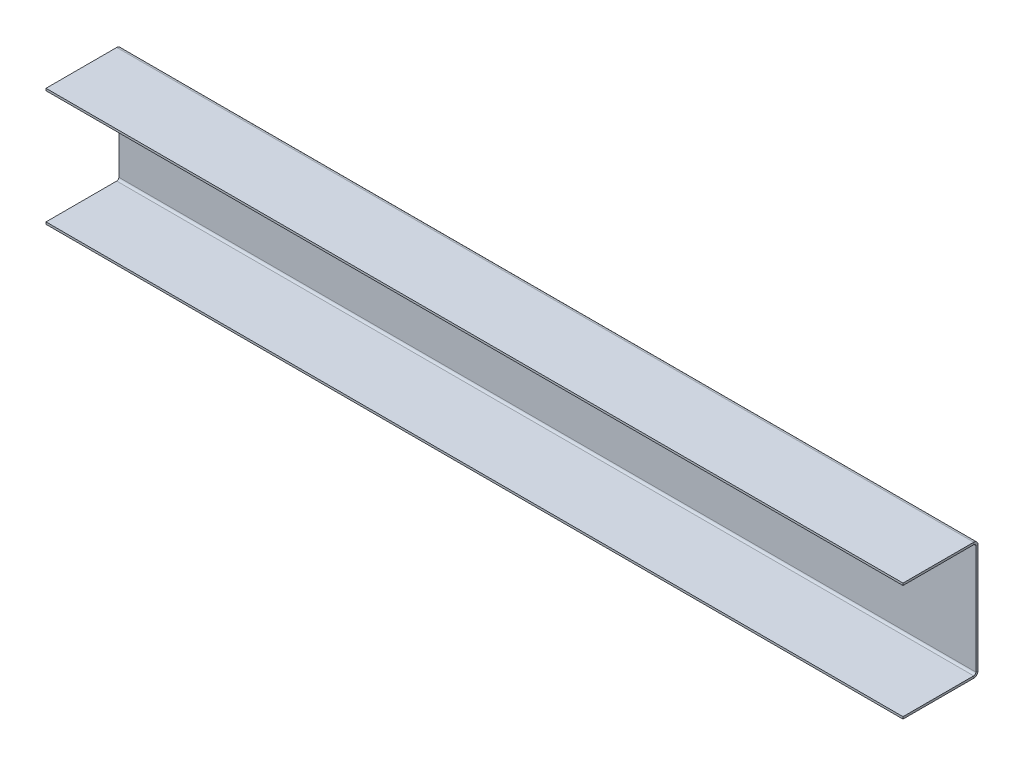
ISO-10303-21;
HEADER;
FILE_DESCRIPTION(('STEP AP214'),'2;1');
FILE_NAME('part.step','',(''),(''),'','','');
FILE_SCHEMA(('AUTOMOTIVE_DESIGN { 1 0 10303 214 1 1 1 1 }'));
ENDSEC;
DATA;
#1=APPLICATION_CONTEXT('core data for automotive mechanical design processes');
#2=APPLICATION_PROTOCOL_DEFINITION('international standard','automotive_design',2000,#1);
#3=PRODUCT_CONTEXT('',#1,'mechanical');
#4=PRODUCT('Part','Part','',(#3));
#5=PRODUCT_RELATED_PRODUCT_CATEGORY('part','',(#4));
#6=PRODUCT_DEFINITION_FORMATION('','',#4);
#7=PRODUCT_DEFINITION_CONTEXT('part definition',#1,'design');
#8=PRODUCT_DEFINITION('design','',#6,#7);
#9=PRODUCT_DEFINITION_SHAPE('','',#8);
#10=(LENGTH_UNIT() NAMED_UNIT(*) SI_UNIT(.MILLI.,.METRE.));
#11=(NAMED_UNIT(*) PLANE_ANGLE_UNIT() SI_UNIT($,.RADIAN.));
#12=(NAMED_UNIT(*) SI_UNIT($,.STERADIAN.) SOLID_ANGLE_UNIT());
#13=UNCERTAINTY_MEASURE_WITH_UNIT(LENGTH_MEASURE(1.E-05),#10,'distance_accuracy_value','');
#14=(GEOMETRIC_REPRESENTATION_CONTEXT(3) GLOBAL_UNCERTAINTY_ASSIGNED_CONTEXT((#13)) GLOBAL_UNIT_ASSIGNED_CONTEXT((#10,
#11,#12)) REPRESENTATION_CONTEXT('',''));
#15=CARTESIAN_POINT('',(0.,0.,0.));
#16=DIRECTION('',(0.,0.,1.));
#17=DIRECTION('',(1.,0.,0.));
#18=AXIS2_PLACEMENT_3D('',#15,#16,#17);
#19=CARTESIAN_POINT('',(0.,0.,-2.));
#20=DIRECTION('',(0.,0.,-1.));
#21=DIRECTION('',(-1.,0.,0.));
#22=AXIS2_PLACEMENT_3D('',#19,#20,#21);
#23=PLANE('',#22);
#24=DIRECTION('',(0.,1.,0.));
#25=VECTOR('',#24,1.);
#26=CARTESIAN_POINT('',(400.,-55.,-2.));
#27=LINE('',#26,#25);
#28=CARTESIAN_POINT('',(400.,-51.,-2.));
#29=VERTEX_POINT('',#28);
#30=CARTESIAN_POINT('',(400.,51.,-2.));
#31=VERTEX_POINT('',#30);
#32=EDGE_CURVE('E26',#29,#31,#27,.T.);
#33=ORIENTED_EDGE('',*,*,#32,.F.);
#34=DIRECTION('',(1.,0.,0.));
#35=VECTOR('',#34,1.);
#36=CARTESIAN_POINT('',(400.,-51.,-2.));
#37=LINE('',#36,#35);
#38=CARTESIAN_POINT('',(-400.,-51.,-2.));
#39=VERTEX_POINT('',#38);
#40=EDGE_CURVE('E149',#29,#39,#37,.F.);
#41=ORIENTED_EDGE('',*,*,#40,.T.);
#42=DIRECTION('',(0.,-1.,0.));
#43=VECTOR('',#42,1.);
#44=CARTESIAN_POINT('',(-400.,-55.,-2.));
#45=LINE('',#44,#43);
#46=CARTESIAN_POINT('',(-400.,51.,-2.));
#47=VERTEX_POINT('',#46);
#48=EDGE_CURVE('E11',#47,#39,#45,.T.);
#49=ORIENTED_EDGE('',*,*,#48,.F.);
#50=DIRECTION('',(-1.,0.,0.));
#51=VECTOR('',#50,1.);
#52=CARTESIAN_POINT('',(-400.,51.,-2.));
#53=LINE('',#52,#51);
#54=EDGE_CURVE('E200',#47,#31,#53,.F.);
#55=ORIENTED_EDGE('',*,*,#54,.T.);
#56=EDGE_LOOP('',(#33,#41,#49,#55));
#57=FACE_BOUND('',#56,.T.);
#58=ADVANCED_FACE('F17',(#57),#23,.T.);
#59=CARTESIAN_POINT('',(0.,0.,0.));
#60=DIRECTION('',(0.,0.,-1.));
#61=DIRECTION('',(-1.,0.,0.));
#62=AXIS2_PLACEMENT_3D('',#59,#60,#61);
#63=PLANE('',#62);
#64=DIRECTION('',(1.,0.,0.));
#65=VECTOR('',#64,1.);
#66=CARTESIAN_POINT('',(400.,-51.,0.));
#67=LINE('',#66,#65);
#68=CARTESIAN_POINT('',(400.,-51.,0.));
#69=VERTEX_POINT('',#68);
#70=CARTESIAN_POINT('',(-400.,-51.,0.));
#71=VERTEX_POINT('',#70);
#72=EDGE_CURVE('E160',#69,#71,#67,.F.);
#73=ORIENTED_EDGE('',*,*,#72,.F.);
#74=DIRECTION('',(0.,1.,0.));
#75=VECTOR('',#74,1.);
#76=CARTESIAN_POINT('',(400.,-55.,0.));
#77=LINE('',#76,#75);
#78=CARTESIAN_POINT('',(400.,51.,0.));
#79=VERTEX_POINT('',#78);
#80=EDGE_CURVE('E217',#69,#79,#77,.T.);
#81=ORIENTED_EDGE('',*,*,#80,.T.);
#82=DIRECTION('',(-1.,0.,0.));
#83=VECTOR('',#82,1.);
#84=CARTESIAN_POINT('',(-400.,51.,0.));
#85=LINE('',#84,#83);
#86=CARTESIAN_POINT('',(-400.,51.,0.));
#87=VERTEX_POINT('',#86);
#88=EDGE_CURVE('E211',#87,#79,#85,.F.);
#89=ORIENTED_EDGE('',*,*,#88,.F.);
#90=DIRECTION('',(0.,-1.,0.));
#91=VECTOR('',#90,1.);
#92=CARTESIAN_POINT('',(-400.,-55.,0.));
#93=LINE('',#92,#91);
#94=EDGE_CURVE('E21',#87,#71,#93,.T.);
#95=ORIENTED_EDGE('',*,*,#94,.T.);
#96=EDGE_LOOP('',(#73,#81,#89,#95));
#97=FACE_BOUND('',#96,.T.);
#98=ADVANCED_FACE('F229',(#97),#63,.F.);
#99=CARTESIAN_POINT('',(400.,-55.,-2.));
#100=DIRECTION('',(1.,0.,0.));
#101=DIRECTION('',(0.,0.,-1.));
#102=AXIS2_PLACEMENT_3D('',#99,#100,#101);
#103=PLANE('',#102);
#104=ORIENTED_EDGE('',*,*,#80,.F.);
#105=DIRECTION('',(0.,0.,-1.));
#106=VECTOR('',#105,1.);
#107=CARTESIAN_POINT('',(400.,-51.,0.));
#108=LINE('',#107,#106);
#109=EDGE_CURVE('E154',#69,#29,#108,.T.);
#110=ORIENTED_EDGE('',*,*,#109,.T.);
#111=ORIENTED_EDGE('',*,*,#32,.T.);
#112=DIRECTION('',(0.,0.,-1.));
#113=VECTOR('',#112,1.);
#114=CARTESIAN_POINT('',(400.,51.,0.));
#115=LINE('',#114,#113);
#116=EDGE_CURVE('E215',#79,#31,#115,.T.);
#117=ORIENTED_EDGE('',*,*,#116,.F.);
#118=EDGE_LOOP('',(#104,#110,#111,#117));
#119=FACE_BOUND('',#118,.T.);
#120=ADVANCED_FACE('F19',(#119),#103,.T.);
#121=CARTESIAN_POINT('',(-400.,-55.,-2.));
#122=DIRECTION('',(-1.,0.,0.));
#123=DIRECTION('',(0.,0.,1.));
#124=AXIS2_PLACEMENT_3D('',#121,#122,#123);
#125=PLANE('',#124);
#126=DIRECTION('',(0.,0.,-1.));
#127=VECTOR('',#126,1.);
#128=CARTESIAN_POINT('',(-400.,-51.,0.));
#129=LINE('',#128,#127);
#130=EDGE_CURVE('E165',#71,#39,#129,.T.);
#131=ORIENTED_EDGE('',*,*,#130,.F.);
#132=ORIENTED_EDGE('',*,*,#94,.F.);
#133=DIRECTION('',(0.,0.,-1.));
#134=VECTOR('',#133,1.);
#135=CARTESIAN_POINT('',(-400.,51.,0.));
#136=LINE('',#135,#134);
#137=EDGE_CURVE('E205',#87,#47,#136,.T.);
#138=ORIENTED_EDGE('',*,*,#137,.T.);
#139=ORIENTED_EDGE('',*,*,#48,.T.);
#140=EDGE_LOOP('',(#131,#132,#138,#139));
#141=FACE_BOUND('',#140,.T.);
#142=ADVANCED_FACE('F232',(#141),#125,.T.);
#143=CARTESIAN_POINT('',(400.,51.,2.));
#144=DIRECTION('',(1.,0.,0.));
#145=DIRECTION('',(0.,0.,-1.));
#146=AXIS2_PLACEMENT_3D('',#143,#144,#145);
#147=PLANE('',#146);
#148=DIRECTION('',(0.,-1.,0.));
#149=VECTOR('',#148,1.);
#150=CARTESIAN_POINT('',(400.,55.,2.));
#151=LINE('',#150,#149);
#152=CARTESIAN_POINT('',(400.,53.,2.));
#153=VERTEX_POINT('',#152);
#154=CARTESIAN_POINT('',(400.,55.,2.));
#155=VERTEX_POINT('',#154);
#156=EDGE_CURVE('E167',#153,#155,#151,.F.);
#157=ORIENTED_EDGE('',*,*,#156,.F.);
#158=CARTESIAN_POINT('',(400.,51.,2.));
#159=DIRECTION('',(-1.,0.,0.));
#160=DIRECTION('',(0.,0.,1.));
#161=AXIS2_PLACEMENT_3D('',#158,#159,#160);
#162=CIRCLE('',#161,2.);
#163=EDGE_CURVE('E208',#79,#153,#162,.F.);
#164=ORIENTED_EDGE('',*,*,#163,.F.);
#165=ORIENTED_EDGE('',*,*,#116,.T.);
#166=CARTESIAN_POINT('',(400.,51.,2.));
#167=DIRECTION('',(-1.,0.,0.));
#168=DIRECTION('',(0.,0.,1.));
#169=AXIS2_PLACEMENT_3D('',#166,#167,#168);
#170=CIRCLE('',#169,4.);
#171=EDGE_CURVE('E34',#31,#155,#170,.F.);
#172=ORIENTED_EDGE('',*,*,#171,.T.);
#173=EDGE_LOOP('',(#157,#164,#165,#172));
#174=FACE_BOUND('',#173,.T.);
#175=ADVANCED_FACE('F247',(#174),#147,.T.);
#176=CARTESIAN_POINT('',(-400.,51.,2.));
#177=DIRECTION('',(1.,0.,0.));
#178=DIRECTION('',(0.,0.,-1.));
#179=AXIS2_PLACEMENT_3D('',#176,#177,#178);
#180=PLANE('',#179);
#181=CARTESIAN_POINT('',(-400.,51.,2.));
#182=DIRECTION('',(-1.,0.,0.));
#183=DIRECTION('',(0.,0.,1.));
#184=AXIS2_PLACEMENT_3D('',#181,#182,#183);
#185=CIRCLE('',#184,2.);
#186=CARTESIAN_POINT('',(-400.,53.,2.));
#187=VERTEX_POINT('',#186);
#188=EDGE_CURVE('E173',#187,#87,#185,.T.);
#189=ORIENTED_EDGE('',*,*,#188,.F.);
#190=DIRECTION('',(0.,-1.,0.));
#191=VECTOR('',#190,1.);
#192=CARTESIAN_POINT('',(-400.,53.,2.00000000000003));
#193=LINE('',#192,#191);
#194=CARTESIAN_POINT('',(-400.,55.,2.00000000000003));
#195=VERTEX_POINT('',#194);
#196=EDGE_CURVE('E193',#187,#195,#193,.F.);
#197=ORIENTED_EDGE('',*,*,#196,.T.);
#198=CARTESIAN_POINT('',(-400.,51.,2.));
#199=DIRECTION('',(-1.,0.,0.));
#200=DIRECTION('',(0.,0.,1.));
#201=AXIS2_PLACEMENT_3D('',#198,#199,#200);
#202=CIRCLE('',#201,4.);
#203=EDGE_CURVE('E203',#195,#47,#202,.T.);
#204=ORIENTED_EDGE('',*,*,#203,.T.);
#205=ORIENTED_EDGE('',*,*,#137,.F.);
#206=EDGE_LOOP('',(#189,#197,#204,#205));
#207=FACE_BOUND('',#206,.T.);
#208=ADVANCED_FACE('F271',(#207),#180,.F.);
#209=CARTESIAN_POINT('',(-400.,51.,2.));
#210=DIRECTION('',(-1.,0.,0.));
#211=DIRECTION('',(0.,1.,0.));
#212=AXIS2_PLACEMENT_3D('',#209,#210,#211);
#213=CYLINDRICAL_SURFACE('',#212,4.);
#214=ORIENTED_EDGE('',*,*,#54,.F.);
#215=ORIENTED_EDGE('',*,*,#203,.F.);
#216=DIRECTION('',(-1.,0.,0.));
#217=VECTOR('',#216,1.);
#218=CARTESIAN_POINT('',(400.,55.,2.));
#219=LINE('',#218,#217);
#220=EDGE_CURVE('E191',#195,#155,#219,.F.);
#221=ORIENTED_EDGE('',*,*,#220,.T.);
#222=ORIENTED_EDGE('',*,*,#171,.F.);
#223=EDGE_LOOP('',(#214,#215,#221,#222));
#224=FACE_BOUND('',#223,.T.);
#225=ADVANCED_FACE('F274',(#224),#213,.T.);
#226=CARTESIAN_POINT('',(-400.,51.,2.));
#227=DIRECTION('',(-1.,0.,0.));
#228=DIRECTION('',(0.,1.,0.));
#229=AXIS2_PLACEMENT_3D('',#226,#227,#228);
#230=CYLINDRICAL_SURFACE('',#229,2.);
#231=ORIENTED_EDGE('',*,*,#88,.T.);
#232=ORIENTED_EDGE('',*,*,#163,.T.);
#233=DIRECTION('',(-1.,0.,0.));
#234=VECTOR('',#233,1.);
#235=CARTESIAN_POINT('',(400.,53.,2.));
#236=LINE('',#235,#234);
#237=EDGE_CURVE('E196',#153,#187,#236,.T.);
#238=ORIENTED_EDGE('',*,*,#237,.T.);
#239=ORIENTED_EDGE('',*,*,#188,.T.);
#240=EDGE_LOOP('',(#231,#232,#238,#239));
#241=FACE_BOUND('',#240,.T.);
#242=ADVANCED_FACE('F250',(#241),#230,.F.);
#243=CARTESIAN_POINT('',(400.,55.,0.));
#244=DIRECTION('',(-1.,0.,0.));
#245=DIRECTION('',(0.,0.,1.));
#246=AXIS2_PLACEMENT_3D('',#243,#244,#245);
#247=PLANE('',#246);
#248=ORIENTED_EDGE('',*,*,#156,.T.);
#249=DIRECTION('',(0.,0.,-1.));
#250=VECTOR('',#249,1.);
#251=CARTESIAN_POINT('',(400.,55.,-1.97802545035135E-13));
#252=LINE('',#251,#250);
#253=CARTESIAN_POINT('',(400.,55.,68.));
#254=VERTEX_POINT('',#253);
#255=EDGE_CURVE('E181',#254,#155,#252,.T.);
#256=ORIENTED_EDGE('',*,*,#255,.F.);
#257=DIRECTION('',(0.,-1.,0.));
#258=VECTOR('',#257,1.);
#259=CARTESIAN_POINT('',(400.,55.,68.));
#260=LINE('',#259,#258);
#261=CARTESIAN_POINT('',(400.,53.,68.));
#262=VERTEX_POINT('',#261);
#263=EDGE_CURVE('E174',#254,#262,#260,.T.);
#264=ORIENTED_EDGE('',*,*,#263,.T.);
#265=DIRECTION('',(0.,0.,1.));
#266=VECTOR('',#265,1.);
#267=CARTESIAN_POINT('',(400.,53.,0.));
#268=LINE('',#267,#266);
#269=EDGE_CURVE('E188',#262,#153,#268,.F.);
#270=ORIENTED_EDGE('',*,*,#269,.T.);
#271=EDGE_LOOP('',(#248,#256,#264,#270));
#272=FACE_BOUND('',#271,.T.);
#273=ADVANCED_FACE('F258',(#272),#247,.F.);
#274=CARTESIAN_POINT('',(-400.,55.,68.));
#275=DIRECTION('',(1.,0.,0.));
#276=DIRECTION('',(0.,0.,-1.));
#277=AXIS2_PLACEMENT_3D('',#274,#275,#276);
#278=PLANE('',#277);
#279=ORIENTED_EDGE('',*,*,#196,.F.);
#280=DIRECTION('',(0.,0.,-1.));
#281=VECTOR('',#280,1.);
#282=CARTESIAN_POINT('',(-400.,53.,68.));
#283=LINE('',#282,#281);
#284=CARTESIAN_POINT('',(-400.,53.,68.));
#285=VERTEX_POINT('',#284);
#286=EDGE_CURVE('E186',#187,#285,#283,.F.);
#287=ORIENTED_EDGE('',*,*,#286,.T.);
#288=DIRECTION('',(0.,-1.,0.));
#289=VECTOR('',#288,1.);
#290=CARTESIAN_POINT('',(-400.,55.,68.));
#291=LINE('',#290,#289);
#292=CARTESIAN_POINT('',(-400.,55.,68.));
#293=VERTEX_POINT('',#292);
#294=EDGE_CURVE('E170',#293,#285,#291,.T.);
#295=ORIENTED_EDGE('',*,*,#294,.F.);
#296=DIRECTION('',(0.,0.,1.));
#297=VECTOR('',#296,1.);
#298=CARTESIAN_POINT('',(-400.,55.,-1.97802545035135E-13));
#299=LINE('',#298,#297);
#300=EDGE_CURVE('E179',#195,#293,#299,.T.);
#301=ORIENTED_EDGE('',*,*,#300,.F.);
#302=EDGE_LOOP('',(#279,#287,#295,#301));
#303=FACE_BOUND('',#302,.T.);
#304=ADVANCED_FACE('F268',(#303),#278,.F.);
#305=CARTESIAN_POINT('',(0.,55.,-1.97802545035135E-13));
#306=DIRECTION('',(0.,-1.,0.));
#307=DIRECTION('',(0.,0.,-1.));
#308=AXIS2_PLACEMENT_3D('',#305,#306,#307);
#309=PLANE('',#308);
#310=ORIENTED_EDGE('',*,*,#220,.F.);
#311=ORIENTED_EDGE('',*,*,#300,.T.);
#312=DIRECTION('',(1.,0.,0.));
#313=VECTOR('',#312,1.);
#314=CARTESIAN_POINT('',(0.,55.,68.));
#315=LINE('',#314,#313);
#316=EDGE_CURVE('E177',#293,#254,#315,.T.);
#317=ORIENTED_EDGE('',*,*,#316,.T.);
#318=ORIENTED_EDGE('',*,*,#255,.T.);
#319=EDGE_LOOP('',(#310,#311,#317,#318));
#320=FACE_BOUND('',#319,.T.);
#321=ADVANCED_FACE('F273',(#320),#309,.F.);
#322=CARTESIAN_POINT('',(0.,53.,-1.90819582357448E-13));
#323=DIRECTION('',(0.,-1.,0.));
#324=DIRECTION('',(0.,0.,-1.));
#325=AXIS2_PLACEMENT_3D('',#322,#323,#324);
#326=PLANE('',#325);
#327=ORIENTED_EDGE('',*,*,#286,.F.);
#328=ORIENTED_EDGE('',*,*,#237,.F.);
#329=ORIENTED_EDGE('',*,*,#269,.F.);
#330=DIRECTION('',(-1.,0.,0.));
#331=VECTOR('',#330,1.);
#332=CARTESIAN_POINT('',(400.,53.,68.));
#333=LINE('',#332,#331);
#334=EDGE_CURVE('E184',#285,#262,#333,.F.);
#335=ORIENTED_EDGE('',*,*,#334,.F.);
#336=EDGE_LOOP('',(#327,#328,#329,#335));
#337=FACE_BOUND('',#336,.T.);
#338=ADVANCED_FACE('F255',(#337),#326,.T.);
#339=CARTESIAN_POINT('',(400.,55.,68.));
#340=DIRECTION('',(0.,0.,-1.));
#341=DIRECTION('',(0.,1.,0.));
#342=AXIS2_PLACEMENT_3D('',#339,#340,#341);
#343=PLANE('',#342);
#344=ORIENTED_EDGE('',*,*,#334,.T.);
#345=ORIENTED_EDGE('',*,*,#263,.F.);
#346=ORIENTED_EDGE('',*,*,#316,.F.);
#347=ORIENTED_EDGE('',*,*,#294,.T.);
#348=EDGE_LOOP('',(#344,#345,#346,#347));
#349=FACE_BOUND('',#348,.T.);
#350=ADVANCED_FACE('F263',(#349),#343,.F.);
#351=CARTESIAN_POINT('',(-400.,-51.,2.));
#352=DIRECTION('',(-1.,0.,0.));
#353=DIRECTION('',(0.,0.,1.));
#354=AXIS2_PLACEMENT_3D('',#351,#352,#353);
#355=PLANE('',#354);
#356=DIRECTION('',(0.,1.,0.));
#357=VECTOR('',#356,1.);
#358=CARTESIAN_POINT('',(-400.,-55.,2.));
#359=LINE('',#358,#357);
#360=CARTESIAN_POINT('',(-400.,-53.,2.));
#361=VERTEX_POINT('',#360);
#362=CARTESIAN_POINT('',(-400.,-55.,2.));
#363=VERTEX_POINT('',#362);
#364=EDGE_CURVE('E132',#361,#363,#359,.F.);
#365=ORIENTED_EDGE('',*,*,#364,.F.);
#366=CARTESIAN_POINT('',(-400.,-51.,2.));
#367=DIRECTION('',(1.,0.,0.));
#368=DIRECTION('',(0.,0.,-1.));
#369=AXIS2_PLACEMENT_3D('',#366,#367,#368);
#370=CIRCLE('',#369,2.);
#371=EDGE_CURVE('E157',#71,#361,#370,.F.);
#372=ORIENTED_EDGE('',*,*,#371,.F.);
#373=ORIENTED_EDGE('',*,*,#130,.T.);
#374=CARTESIAN_POINT('',(-400.,-51.,2.));
#375=DIRECTION('',(1.,0.,0.));
#376=DIRECTION('',(0.,0.,-1.));
#377=AXIS2_PLACEMENT_3D('',#374,#375,#376);
#378=CIRCLE('',#377,4.);
#379=EDGE_CURVE('E42',#39,#363,#378,.F.);
#380=ORIENTED_EDGE('',*,*,#379,.T.);
#381=EDGE_LOOP('',(#365,#372,#373,#380));
#382=FACE_BOUND('',#381,.T.);
#383=ADVANCED_FACE('F236',(#382),#355,.T.);
#384=CARTESIAN_POINT('',(400.,-51.,2.));
#385=DIRECTION('',(-1.,0.,0.));
#386=DIRECTION('',(0.,0.,1.));
#387=AXIS2_PLACEMENT_3D('',#384,#385,#386);
#388=PLANE('',#387);
#389=CARTESIAN_POINT('',(400.,-51.,2.));
#390=DIRECTION('',(1.,0.,0.));
#391=DIRECTION('',(0.,0.,-1.));
#392=AXIS2_PLACEMENT_3D('',#389,#390,#391);
#393=CIRCLE('',#392,2.);
#394=CARTESIAN_POINT('',(400.,-53.,2.));
#395=VERTEX_POINT('',#394);
#396=EDGE_CURVE('E162',#395,#69,#393,.T.);
#397=ORIENTED_EDGE('',*,*,#396,.F.);
#398=DIRECTION('',(0.,1.,0.));
#399=VECTOR('',#398,1.);
#400=CARTESIAN_POINT('',(400.,-53.,1.99999999999997));
#401=LINE('',#400,#399);
#402=CARTESIAN_POINT('',(400.,-55.,1.99999999999996));
#403=VERTEX_POINT('',#402);
#404=EDGE_CURVE('E143',#395,#403,#401,.F.);
#405=ORIENTED_EDGE('',*,*,#404,.T.);
#406=CARTESIAN_POINT('',(400.,-51.,2.));
#407=DIRECTION('',(1.,0.,0.));
#408=DIRECTION('',(0.,0.,-1.));
#409=AXIS2_PLACEMENT_3D('',#406,#407,#408);
#410=CIRCLE('',#409,4.);
#411=EDGE_CURVE('E152',#403,#29,#410,.T.);
#412=ORIENTED_EDGE('',*,*,#411,.T.);
#413=ORIENTED_EDGE('',*,*,#109,.F.);
#414=EDGE_LOOP('',(#397,#405,#412,#413));
#415=FACE_BOUND('',#414,.T.);
#416=ADVANCED_FACE('F242',(#415),#388,.F.);
#417=CARTESIAN_POINT('',(400.,-51.,2.));
#418=DIRECTION('',(1.,0.,0.));
#419=DIRECTION('',(0.,-1.,0.));
#420=AXIS2_PLACEMENT_3D('',#417,#418,#419);
#421=CYLINDRICAL_SURFACE('',#420,4.);
#422=ORIENTED_EDGE('',*,*,#40,.F.);
#423=ORIENTED_EDGE('',*,*,#411,.F.);
#424=DIRECTION('',(1.,0.,0.));
#425=VECTOR('',#424,1.);
#426=CARTESIAN_POINT('',(-400.,-55.,2.));
#427=LINE('',#426,#425);
#428=EDGE_CURVE('E141',#403,#363,#427,.F.);
#429=ORIENTED_EDGE('',*,*,#428,.T.);
#430=ORIENTED_EDGE('',*,*,#379,.F.);
#431=EDGE_LOOP('',(#422,#423,#429,#430));
#432=FACE_BOUND('',#431,.T.);
#433=ADVANCED_FACE('F239',(#432),#421,.T.);
#434=CARTESIAN_POINT('',(400.,-51.,2.));
#435=DIRECTION('',(1.,0.,0.));
#436=DIRECTION('',(0.,-1.,0.));
#437=AXIS2_PLACEMENT_3D('',#434,#435,#436);
#438=CYLINDRICAL_SURFACE('',#437,2.);
#439=ORIENTED_EDGE('',*,*,#72,.T.);
#440=ORIENTED_EDGE('',*,*,#371,.T.);
#441=DIRECTION('',(1.,0.,0.));
#442=VECTOR('',#441,1.);
#443=CARTESIAN_POINT('',(-400.,-53.,2.));
#444=LINE('',#443,#442);
#445=EDGE_CURVE('E146',#361,#395,#444,.T.);
#446=ORIENTED_EDGE('',*,*,#445,.T.);
#447=ORIENTED_EDGE('',*,*,#396,.T.);
#448=EDGE_LOOP('',(#439,#440,#446,#447));
#449=FACE_BOUND('',#448,.T.);
#450=ADVANCED_FACE('F396',(#449),#438,.F.);
#451=CARTESIAN_POINT('',(-400.,-55.,0.));
#452=DIRECTION('',(1.,0.,0.));
#453=DIRECTION('',(0.,0.,-1.));
#454=AXIS2_PLACEMENT_3D('',#451,#452,#453);
#455=PLANE('',#454);
#456=ORIENTED_EDGE('',*,*,#364,.T.);
#457=DIRECTION('',(0.,0.,-1.));
#458=VECTOR('',#457,1.);
#459=CARTESIAN_POINT('',(-400.,-55.,-1.97802545035135E-13));
#460=LINE('',#459,#458);
#461=CARTESIAN_POINT('',(-400.,-55.,68.));
#462=VERTEX_POINT('',#461);
#463=EDGE_CURVE('E113',#462,#363,#460,.T.);
#464=ORIENTED_EDGE('',*,*,#463,.F.);
#465=DIRECTION('',(0.,1.,0.));
#466=VECTOR('',#465,1.);
#467=CARTESIAN_POINT('',(-400.,-55.,68.));
#468=LINE('',#467,#466);
#469=CARTESIAN_POINT('',(-400.,-53.,68.));
#470=VERTEX_POINT('',#469);
#471=EDGE_CURVE('E119',#462,#470,#468,.T.);
#472=ORIENTED_EDGE('',*,*,#471,.T.);
#473=DIRECTION('',(0.,0.,1.));
#474=VECTOR('',#473,1.);
#475=CARTESIAN_POINT('',(-400.,-53.,0.));
#476=LINE('',#475,#474);
#477=EDGE_CURVE('E139',#470,#361,#476,.F.);
#478=ORIENTED_EDGE('',*,*,#477,.T.);
#479=EDGE_LOOP('',(#456,#464,#472,#478));
#480=FACE_BOUND('',#479,.T.);
#481=ADVANCED_FACE('F131',(#480),#455,.F.);
#482=CARTESIAN_POINT('',(400.,-55.,68.));
#483=DIRECTION('',(-1.,0.,0.));
#484=DIRECTION('',(0.,0.,1.));
#485=AXIS2_PLACEMENT_3D('',#482,#483,#484);
#486=PLANE('',#485);
#487=ORIENTED_EDGE('',*,*,#404,.F.);
#488=DIRECTION('',(0.,0.,-1.));
#489=VECTOR('',#488,1.);
#490=CARTESIAN_POINT('',(400.,-53.,68.));
#491=LINE('',#490,#489);
#492=CARTESIAN_POINT('',(400.,-53.,68.));
#493=VERTEX_POINT('',#492);
#494=EDGE_CURVE('E135',#395,#493,#491,.F.);
#495=ORIENTED_EDGE('',*,*,#494,.T.);
#496=DIRECTION('',(0.,1.,0.));
#497=VECTOR('',#496,1.);
#498=CARTESIAN_POINT('',(400.,-55.,68.));
#499=LINE('',#498,#497);
#500=CARTESIAN_POINT('',(400.,-55.,68.));
#501=VERTEX_POINT('',#500);
#502=EDGE_CURVE('E128',#501,#493,#499,.T.);
#503=ORIENTED_EDGE('',*,*,#502,.F.);
#504=DIRECTION('',(0.,0.,1.));
#505=VECTOR('',#504,1.);
#506=CARTESIAN_POINT('',(400.,-55.,-1.97802545035135E-13));
#507=LINE('',#506,#505);
#508=EDGE_CURVE('E115',#403,#501,#507,.T.);
#509=ORIENTED_EDGE('',*,*,#508,.F.);
#510=EDGE_LOOP('',(#487,#495,#503,#509));
#511=FACE_BOUND('',#510,.T.);
#512=ADVANCED_FACE('F414',(#511),#486,.F.);
#513=CARTESIAN_POINT('',(0.,-55.,-1.97802545035135E-13));
#514=DIRECTION('',(0.,1.,0.));
#515=DIRECTION('',(0.,0.,1.));
#516=AXIS2_PLACEMENT_3D('',#513,#514,#515);
#517=PLANE('',#516);
#518=ORIENTED_EDGE('',*,*,#428,.F.);
#519=ORIENTED_EDGE('',*,*,#508,.T.);
#520=DIRECTION('',(-1.,0.,0.));
#521=VECTOR('',#520,1.);
#522=CARTESIAN_POINT('',(0.,-55.,68.));
#523=LINE('',#522,#521);
#524=EDGE_CURVE('E108',#501,#462,#523,.T.);
#525=ORIENTED_EDGE('',*,*,#524,.T.);
#526=ORIENTED_EDGE('',*,*,#463,.T.);
#527=EDGE_LOOP('',(#518,#519,#525,#526));
#528=FACE_BOUND('',#527,.T.);
#529=ADVANCED_FACE('F111',(#528),#517,.F.);
#530=CARTESIAN_POINT('',(0.,-53.,-1.90819582357448E-13));
#531=DIRECTION('',(0.,1.,0.));
#532=DIRECTION('',(0.,0.,1.));
#533=AXIS2_PLACEMENT_3D('',#530,#531,#532);
#534=PLANE('',#533);
#535=ORIENTED_EDGE('',*,*,#494,.F.);
#536=ORIENTED_EDGE('',*,*,#445,.F.);
#537=ORIENTED_EDGE('',*,*,#477,.F.);
#538=DIRECTION('',(1.,0.,0.));
#539=VECTOR('',#538,1.);
#540=CARTESIAN_POINT('',(-400.,-53.,68.));
#541=LINE('',#540,#539);
#542=EDGE_CURVE('E124',#493,#470,#541,.F.);
#543=ORIENTED_EDGE('',*,*,#542,.F.);
#544=EDGE_LOOP('',(#535,#536,#537,#543));
#545=FACE_BOUND('',#544,.T.);
#546=ADVANCED_FACE('F432',(#545),#534,.T.);
#547=CARTESIAN_POINT('',(-400.,-55.,68.));
#548=DIRECTION('',(0.,0.,-1.));
#549=DIRECTION('',(0.,1.,0.));
#550=AXIS2_PLACEMENT_3D('',#547,#548,#549);
#551=PLANE('',#550);
#552=ORIENTED_EDGE('',*,*,#542,.T.);
#553=ORIENTED_EDGE('',*,*,#471,.F.);
#554=ORIENTED_EDGE('',*,*,#524,.F.);
#555=ORIENTED_EDGE('',*,*,#502,.T.);
#556=EDGE_LOOP('',(#552,#553,#554,#555));
#557=FACE_BOUND('',#556,.T.);
#558=ADVANCED_FACE('F122',(#557),#551,.F.);
#559=CLOSED_SHELL('',(#58,#98,#120,#142,#175,#208,#225,#242,#273,#304,#321,#338,#350,#383,#416,
#433,#450,#481,#512,#529,#546,#558));
#560=MANIFOLD_SOLID_BREP('B1',#559);
#561=ADVANCED_BREP_SHAPE_REPRESENTATION('',(#18,#560),#14);
#562=SHAPE_DEFINITION_REPRESENTATION(#9,#561);
ENDSEC;
END-ISO-10303-21;
